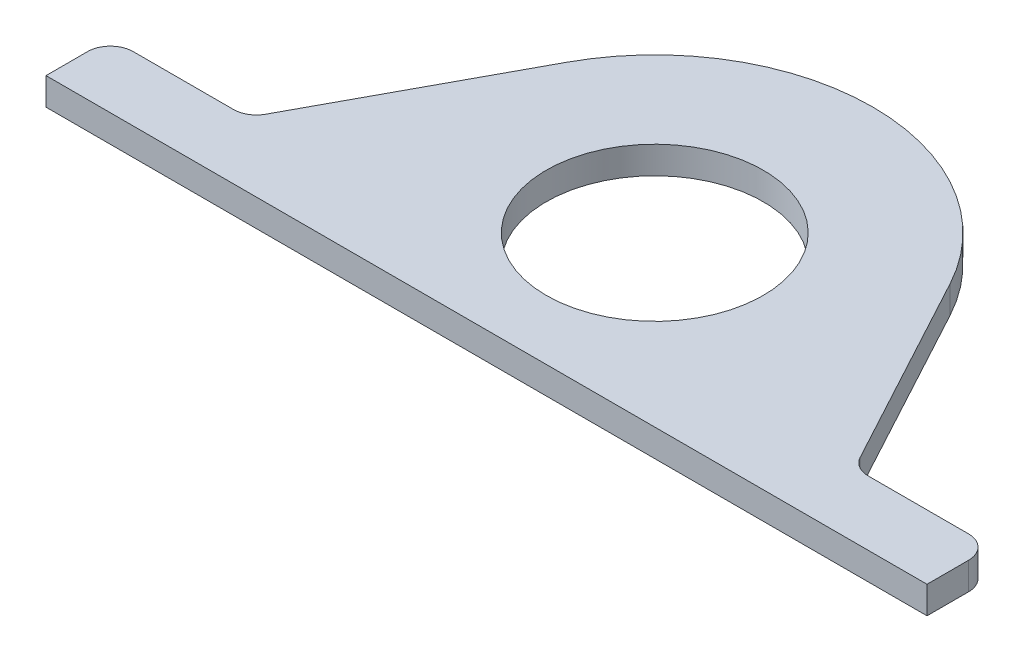
ISO-10303-21;
HEADER;
FILE_DESCRIPTION(('STEP AP214'),'2;1');
FILE_NAME('part.step','',(''),(''),'','','');
FILE_SCHEMA(('AUTOMOTIVE_DESIGN { 1 0 10303 214 1 1 1 1 }'));
ENDSEC;
DATA;
#1=APPLICATION_CONTEXT('core data for automotive mechanical design processes');
#2=APPLICATION_PROTOCOL_DEFINITION('international standard','automotive_design',2000,#1);
#3=PRODUCT_CONTEXT('',#1,'mechanical');
#4=PRODUCT('Part','Part','',(#3));
#5=PRODUCT_RELATED_PRODUCT_CATEGORY('part','',(#4));
#6=PRODUCT_DEFINITION_FORMATION('','',#4);
#7=PRODUCT_DEFINITION_CONTEXT('part definition',#1,'design');
#8=PRODUCT_DEFINITION('design','',#6,#7);
#9=PRODUCT_DEFINITION_SHAPE('','',#8);
#10=(LENGTH_UNIT() NAMED_UNIT(*) SI_UNIT(.MILLI.,.METRE.));
#11=(NAMED_UNIT(*) PLANE_ANGLE_UNIT() SI_UNIT($,.RADIAN.));
#12=(NAMED_UNIT(*) SI_UNIT($,.STERADIAN.) SOLID_ANGLE_UNIT());
#13=UNCERTAINTY_MEASURE_WITH_UNIT(LENGTH_MEASURE(1.E-05),#10,'distance_accuracy_value','');
#14=(GEOMETRIC_REPRESENTATION_CONTEXT(3) GLOBAL_UNCERTAINTY_ASSIGNED_CONTEXT((#13)) GLOBAL_UNIT_ASSIGNED_CONTEXT((#10,
#11,#12)) REPRESENTATION_CONTEXT('',''));
#15=CARTESIAN_POINT('',(0.,0.,0.));
#16=DIRECTION('',(0.,0.,1.));
#17=DIRECTION('',(1.,0.,0.));
#18=AXIS2_PLACEMENT_3D('',#15,#16,#17);
#19=CARTESIAN_POINT('',(-91.605676950577,6.,27.7755528274665));
#20=DIRECTION('',(0.,-1.,0.));
#21=DIRECTION('',(0.,0.,-1.));
#22=AXIS2_PLACEMENT_3D('',#19,#20,#21);
#23=PLANE('',#22);
#24=DIRECTION('',(0.,0.,1.));
#25=VECTOR('',#24,1.);
#26=CARTESIAN_POINT('',(-96.605676950577,6.,27.7755528274665));
#27=LINE('',#26,#25);
#28=CARTESIAN_POINT('',(-96.605676950577,6.,27.7755528274665));
#29=VERTEX_POINT('',#28);
#30=CARTESIAN_POINT('',(-96.605676950577,6.,36.9));
#31=VERTEX_POINT('',#30);
#32=EDGE_CURVE('E148',#29,#31,#27,.T.);
#33=ORIENTED_EDGE('',*,*,#32,.T.);
#34=DIRECTION('',(1.,0.,0.));
#35=VECTOR('',#34,1.);
#36=CARTESIAN_POINT('',(-91.605676950577,6.,36.9));
#37=LINE('',#36,#35);
#38=CARTESIAN_POINT('',(96.6056769505771,6.,36.9));
#39=VERTEX_POINT('',#38);
#40=EDGE_CURVE('E48',#31,#39,#37,.T.);
#41=ORIENTED_EDGE('',*,*,#40,.T.);
#42=DIRECTION('',(0.,0.,-1.));
#43=VECTOR('',#42,1.);
#44=CARTESIAN_POINT('',(96.605676950577,6.,27.7755528274665));
#45=LINE('',#44,#43);
#46=CARTESIAN_POINT('',(96.605676950577,6.,27.7755528274665));
#47=VERTEX_POINT('',#46);
#48=EDGE_CURVE('E102',#39,#47,#45,.T.);
#49=ORIENTED_EDGE('',*,*,#48,.T.);
#50=CARTESIAN_POINT('',(91.605676950577,6.,27.7755528274665));
#51=DIRECTION('',(0.,1.,0.));
#52=DIRECTION('',(0.,0.,-1.));
#53=AXIS2_PLACEMENT_3D('',#50,#51,#52);
#54=CIRCLE('',#53,5.00000000000001);
#55=CARTESIAN_POINT('',(91.605676950577,6.,22.7755528274664));
#56=VERTEX_POINT('',#55);
#57=EDGE_CURVE('E199',#47,#56,#54,.T.);
#58=ORIENTED_EDGE('',*,*,#57,.T.);
#59=DIRECTION('',(-1.,0.,0.));
#60=VECTOR('',#59,1.);
#61=CARTESIAN_POINT('',(69.5890954122525,6.,22.7755528274664));
#62=LINE('',#61,#60);
#63=CARTESIAN_POINT('',(69.5890954122525,6.,22.7755528274664));
#64=VERTEX_POINT('',#63);
#65=EDGE_CURVE('E221',#56,#64,#62,.T.);
#66=ORIENTED_EDGE('',*,*,#65,.T.);
#67=CARTESIAN_POINT('',(69.5890954122525,6.,17.7755528274664));
#68=DIRECTION('',(0.,-1.,0.));
#69=DIRECTION('',(0.,0.,1.));
#70=AXIS2_PLACEMENT_3D('',#67,#68,#69);
#71=CIRCLE('',#70,5.00000000000001);
#72=CARTESIAN_POINT('',(65.1888751835243,6.,20.1500131743014));
#73=VERTEX_POINT('',#72);
#74=EDGE_CURVE('E218',#64,#73,#71,.T.);
#75=ORIENTED_EDGE('',*,*,#74,.T.);
#76=DIRECTION('',(-0.474892069366983,0.,-0.880044045745635));
#77=VECTOR('',#76,1.);
#78=CARTESIAN_POINT('',(42.0661053866413,6.,-22.6998409157418));
#79=LINE('',#78,#77);
#80=CARTESIAN_POINT('',(42.0661053866413,6.,-22.6998409157418));
#81=VERTEX_POINT('',#80);
#82=EDGE_CURVE('E220',#73,#81,#79,.T.);
#83=ORIENTED_EDGE('',*,*,#82,.T.);
#84=CARTESIAN_POINT('',(0.,6.,0.));
#85=DIRECTION('',(0.,1.,0.));
#86=DIRECTION('',(0.,0.,1.));
#87=AXIS2_PLACEMENT_3D('',#84,#85,#86);
#88=CIRCLE('',#87,47.8);
#89=CARTESIAN_POINT('',(-42.0661053866413,6.,-22.6998409157417));
#90=VERTEX_POINT('',#89);
#91=EDGE_CURVE('E223',#81,#90,#88,.T.);
#92=ORIENTED_EDGE('',*,*,#91,.T.);
#93=DIRECTION('',(-0.474892069366983,0.,0.880044045745635));
#94=VECTOR('',#93,1.);
#95=CARTESIAN_POINT('',(-65.1888751835243,6.,20.1500131743014));
#96=LINE('',#95,#94);
#97=CARTESIAN_POINT('',(-65.1888751835243,6.,20.1500131743014));
#98=VERTEX_POINT('',#97);
#99=EDGE_CURVE('E131',#90,#98,#96,.T.);
#100=ORIENTED_EDGE('',*,*,#99,.T.);
#101=CARTESIAN_POINT('',(-69.5890954122525,6.,17.7755528274665));
#102=DIRECTION('',(0.,-1.,0.));
#103=DIRECTION('',(0.,0.,-1.));
#104=AXIS2_PLACEMENT_3D('',#101,#102,#103);
#105=CIRCLE('',#104,5.00000000000001);
#106=CARTESIAN_POINT('',(-69.5890954122525,6.,22.7755528274665));
#107=VERTEX_POINT('',#106);
#108=EDGE_CURVE('E124',#98,#107,#105,.T.);
#109=ORIENTED_EDGE('',*,*,#108,.T.);
#110=DIRECTION('',(-1.,0.,0.));
#111=VECTOR('',#110,1.);
#112=CARTESIAN_POINT('',(-69.5890954122525,6.,22.7755528274665));
#113=LINE('',#112,#111);
#114=CARTESIAN_POINT('',(-91.605676950577,6.,22.7755528274665));
#115=VERTEX_POINT('',#114);
#116=EDGE_CURVE('E128',#107,#115,#113,.T.);
#117=ORIENTED_EDGE('',*,*,#116,.T.);
#118=CARTESIAN_POINT('',(-91.605676950577,6.,27.7755528274665));
#119=DIRECTION('',(0.,1.,0.));
#120=DIRECTION('',(0.,0.,-1.));
#121=AXIS2_PLACEMENT_3D('',#118,#119,#120);
#122=CIRCLE('',#121,5.00000000000001);
#123=EDGE_CURVE('E56',#115,#29,#122,.T.);
#124=ORIENTED_EDGE('',*,*,#123,.T.);
#125=EDGE_LOOP('',(#33,#41,#49,#58,#66,#75,#83,#92,#100,#109,#117,#124));
#126=FACE_BOUND('',#125,.T.);
#127=CARTESIAN_POINT('',(0.,6.,0.));
#128=DIRECTION('',(0.,1.,0.));
#129=DIRECTION('',(0.,0.,1.));
#130=AXIS2_PLACEMENT_3D('',#127,#128,#129);
#131=CIRCLE('',#130,23.8);
#132=CARTESIAN_POINT('',(0.,6.,23.8));
#133=VERTEX_POINT('',#132);
#134=EDGE_CURVE('E157',#133,#133,#131,.T.);
#135=ORIENTED_EDGE('',*,*,#134,.F.);
#136=EDGE_LOOP('',(#135));
#137=FACE_BOUND('',#136,.T.);
#138=ADVANCED_FACE('F33',(#126,#137),#23,.F.);
#139=CARTESIAN_POINT('',(-91.605676950577,0.,27.7755528274665));
#140=DIRECTION('',(0.,-1.,0.));
#141=DIRECTION('',(0.,0.,-1.));
#142=AXIS2_PLACEMENT_3D('',#139,#140,#141);
#143=PLANE('',#142);
#144=DIRECTION('',(1.,0.,0.));
#145=VECTOR('',#144,1.);
#146=CARTESIAN_POINT('',(114.691020375286,0.,36.9));
#147=LINE('',#146,#145);
#148=CARTESIAN_POINT('',(-96.605676950577,0.,36.9));
#149=VERTEX_POINT('',#148);
#150=CARTESIAN_POINT('',(96.605676950577,0.,36.9));
#151=VERTEX_POINT('',#150);
#152=EDGE_CURVE('E243',#149,#151,#147,.T.);
#153=ORIENTED_EDGE('',*,*,#152,.F.);
#154=DIRECTION('',(0.,0.,1.));
#155=VECTOR('',#154,1.);
#156=CARTESIAN_POINT('',(-96.605676950577,0.,27.7755528274665));
#157=LINE('',#156,#155);
#158=CARTESIAN_POINT('',(-96.605676950577,0.,27.7755528274665));
#159=VERTEX_POINT('',#158);
#160=EDGE_CURVE('E173',#159,#149,#157,.T.);
#161=ORIENTED_EDGE('',*,*,#160,.F.);
#162=CARTESIAN_POINT('',(-91.605676950577,0.,27.7755528274665));
#163=DIRECTION('',(0.,1.,0.));
#164=DIRECTION('',(0.,0.,-1.));
#165=AXIS2_PLACEMENT_3D('',#162,#163,#164);
#166=CIRCLE('',#165,5.00000000000001);
#167=CARTESIAN_POINT('',(-91.605676950577,0.,22.7755528274665));
#168=VERTEX_POINT('',#167);
#169=EDGE_CURVE('E95',#168,#159,#166,.T.);
#170=ORIENTED_EDGE('',*,*,#169,.F.);
#171=DIRECTION('',(-1.,0.,0.));
#172=VECTOR('',#171,1.);
#173=CARTESIAN_POINT('',(-69.5890954122525,0.,22.7755528274665));
#174=LINE('',#173,#172);
#175=CARTESIAN_POINT('',(-69.5890954122525,0.,22.7755528274665));
#176=VERTEX_POINT('',#175);
#177=EDGE_CURVE('E170',#176,#168,#174,.T.);
#178=ORIENTED_EDGE('',*,*,#177,.F.);
#179=CARTESIAN_POINT('',(-69.5890954122525,0.,17.7755528274665));
#180=DIRECTION('',(0.,-1.,0.));
#181=DIRECTION('',(0.,0.,-1.));
#182=AXIS2_PLACEMENT_3D('',#179,#180,#181);
#183=CIRCLE('',#182,5.00000000000001);
#184=CARTESIAN_POINT('',(-65.1888751835243,0.,20.1500131743014));
#185=VERTEX_POINT('',#184);
#186=EDGE_CURVE('E140',#185,#176,#183,.T.);
#187=ORIENTED_EDGE('',*,*,#186,.F.);
#188=DIRECTION('',(-0.474892069366983,0.,0.880044045745635));
#189=VECTOR('',#188,1.);
#190=CARTESIAN_POINT('',(-65.1888751835243,0.,20.1500131743014));
#191=LINE('',#190,#189);
#192=CARTESIAN_POINT('',(-42.0661053866413,0.,-22.6998409157417));
#193=VERTEX_POINT('',#192);
#194=EDGE_CURVE('E167',#193,#185,#191,.T.);
#195=ORIENTED_EDGE('',*,*,#194,.F.);
#196=CARTESIAN_POINT('',(0.,0.,0.));
#197=DIRECTION('',(0.,1.,0.));
#198=DIRECTION('',(0.,0.,1.));
#199=AXIS2_PLACEMENT_3D('',#196,#197,#198);
#200=CIRCLE('',#199,47.8);
#201=CARTESIAN_POINT('',(42.0661053866413,0.,-22.6998409157418));
#202=VERTEX_POINT('',#201);
#203=EDGE_CURVE('E165',#202,#193,#200,.T.);
#204=ORIENTED_EDGE('',*,*,#203,.F.);
#205=DIRECTION('',(-0.474892069366983,0.,-0.880044045745635));
#206=VECTOR('',#205,1.);
#207=CARTESIAN_POINT('',(42.0661053866413,0.,-22.6998409157418));
#208=LINE('',#207,#206);
#209=CARTESIAN_POINT('',(65.1888751835243,0.,20.1500131743014));
#210=VERTEX_POINT('',#209);
#211=EDGE_CURVE('E163',#210,#202,#208,.T.);
#212=ORIENTED_EDGE('',*,*,#211,.F.);
#213=CARTESIAN_POINT('',(69.5890954122525,0.,17.7755528274664));
#214=DIRECTION('',(0.,-1.,0.));
#215=DIRECTION('',(0.,0.,1.));
#216=AXIS2_PLACEMENT_3D('',#213,#214,#215);
#217=CIRCLE('',#216,5.00000000000001);
#218=CARTESIAN_POINT('',(69.5890954122525,0.,22.7755528274664));
#219=VERTEX_POINT('',#218);
#220=EDGE_CURVE('E161',#219,#210,#217,.T.);
#221=ORIENTED_EDGE('',*,*,#220,.F.);
#222=DIRECTION('',(-1.,0.,0.));
#223=VECTOR('',#222,1.);
#224=CARTESIAN_POINT('',(69.5890954122525,0.,22.7755528274664));
#225=LINE('',#224,#223);
#226=CARTESIAN_POINT('',(91.605676950577,0.,22.7755528274664));
#227=VERTEX_POINT('',#226);
#228=EDGE_CURVE('E159',#227,#219,#225,.T.);
#229=ORIENTED_EDGE('',*,*,#228,.F.);
#230=CARTESIAN_POINT('',(91.605676950577,0.,27.7755528274665));
#231=DIRECTION('',(0.,1.,0.));
#232=DIRECTION('',(0.,0.,-1.));
#233=AXIS2_PLACEMENT_3D('',#230,#231,#232);
#234=CIRCLE('',#233,5.00000000000001);
#235=CARTESIAN_POINT('',(96.605676950577,0.,27.7755528274665));
#236=VERTEX_POINT('',#235);
#237=EDGE_CURVE('E156',#236,#227,#234,.T.);
#238=ORIENTED_EDGE('',*,*,#237,.F.);
#239=DIRECTION('',(0.,0.,-1.));
#240=VECTOR('',#239,1.);
#241=CARTESIAN_POINT('',(96.605676950577,0.,27.7755528274665));
#242=LINE('',#241,#240);
#243=EDGE_CURVE('E154',#151,#236,#242,.T.);
#244=ORIENTED_EDGE('',*,*,#243,.F.);
#245=EDGE_LOOP('',(#153,#161,#170,#178,#187,#195,#204,#212,#221,#229,#238,#244));
#246=FACE_BOUND('',#245,.T.);
#247=CARTESIAN_POINT('',(0.,0.,0.));
#248=DIRECTION('',(0.,1.,0.));
#249=DIRECTION('',(0.,0.,1.));
#250=AXIS2_PLACEMENT_3D('',#247,#248,#249);
#251=CIRCLE('',#250,23.8);
#252=CARTESIAN_POINT('',(0.,0.,23.8));
#253=VERTEX_POINT('',#252);
#254=EDGE_CURVE('E248',#253,#253,#251,.T.);
#255=ORIENTED_EDGE('',*,*,#254,.T.);
#256=EDGE_LOOP('',(#255));
#257=FACE_BOUND('',#256,.T.);
#258=ADVANCED_FACE('F205',(#246,#257),#143,.T.);
#259=CARTESIAN_POINT('',(96.605676950577,6.,27.7755528274665));
#260=DIRECTION('',(-1.,0.,0.));
#261=DIRECTION('',(0.,0.,1.));
#262=AXIS2_PLACEMENT_3D('',#259,#260,#261);
#263=PLANE('',#262);
#264=ORIENTED_EDGE('',*,*,#48,.F.);
#265=DIRECTION('',(0.,-1.,0.));
#266=VECTOR('',#265,1.);
#267=CARTESIAN_POINT('',(96.605676950577,6.,36.9));
#268=LINE('',#267,#266);
#269=EDGE_CURVE('E242',#39,#151,#268,.T.);
#270=ORIENTED_EDGE('',*,*,#269,.T.);
#271=ORIENTED_EDGE('',*,*,#243,.T.);
#272=DIRECTION('',(0.,-1.,0.));
#273=VECTOR('',#272,1.);
#274=CARTESIAN_POINT('',(96.605676950577,6.,27.7755528274665));
#275=LINE('',#274,#273);
#276=EDGE_CURVE('E41',#47,#236,#275,.T.);
#277=ORIENTED_EDGE('',*,*,#276,.F.);
#278=EDGE_LOOP('',(#264,#270,#271,#277));
#279=FACE_BOUND('',#278,.T.);
#280=ADVANCED_FACE('F35',(#279),#263,.F.);
#281=CARTESIAN_POINT('',(91.605676950577,6.,27.7755528274665));
#282=DIRECTION('',(0.,-1.,0.));
#283=DIRECTION('',(0.,0.,-1.));
#284=AXIS2_PLACEMENT_3D('',#281,#282,#283);
#285=CYLINDRICAL_SURFACE('',#284,5.00000000000001);
#286=ORIENTED_EDGE('',*,*,#237,.T.);
#287=DIRECTION('',(0.,-1.,0.));
#288=VECTOR('',#287,1.);
#289=CARTESIAN_POINT('',(91.605676950577,6.,22.7755528274664));
#290=LINE('',#289,#288);
#291=EDGE_CURVE('E191',#56,#227,#290,.T.);
#292=ORIENTED_EDGE('',*,*,#291,.F.);
#293=ORIENTED_EDGE('',*,*,#57,.F.);
#294=ORIENTED_EDGE('',*,*,#276,.T.);
#295=EDGE_LOOP('',(#286,#292,#293,#294));
#296=FACE_BOUND('',#295,.T.);
#297=ADVANCED_FACE('F197',(#296),#285,.T.);
#298=CARTESIAN_POINT('',(69.5890954122525,6.,22.7755528274664));
#299=DIRECTION('',(0.,0.,1.));
#300=DIRECTION('',(1.,0.,0.));
#301=AXIS2_PLACEMENT_3D('',#298,#299,#300);
#302=PLANE('',#301);
#303=ORIENTED_EDGE('',*,*,#228,.T.);
#304=DIRECTION('',(0.,-1.,0.));
#305=VECTOR('',#304,1.);
#306=CARTESIAN_POINT('',(69.5890954122525,6.,22.7755528274664));
#307=LINE('',#306,#305);
#308=EDGE_CURVE('E188',#64,#219,#307,.T.);
#309=ORIENTED_EDGE('',*,*,#308,.F.);
#310=ORIENTED_EDGE('',*,*,#65,.F.);
#311=ORIENTED_EDGE('',*,*,#291,.T.);
#312=EDGE_LOOP('',(#303,#309,#310,#311));
#313=FACE_BOUND('',#312,.T.);
#314=ADVANCED_FACE('F212',(#313),#302,.F.);
#315=CARTESIAN_POINT('',(69.5890954122525,6.,17.7755528274664));
#316=DIRECTION('',(0.,-1.,0.));
#317=DIRECTION('',(0.,0.,-1.));
#318=AXIS2_PLACEMENT_3D('',#315,#316,#317);
#319=CYLINDRICAL_SURFACE('',#318,5.00000000000001);
#320=ORIENTED_EDGE('',*,*,#220,.T.);
#321=DIRECTION('',(0.,-1.,0.));
#322=VECTOR('',#321,1.);
#323=CARTESIAN_POINT('',(65.1888751835243,6.,20.1500131743014));
#324=LINE('',#323,#322);
#325=EDGE_CURVE('E185',#73,#210,#324,.T.);
#326=ORIENTED_EDGE('',*,*,#325,.F.);
#327=ORIENTED_EDGE('',*,*,#74,.F.);
#328=ORIENTED_EDGE('',*,*,#308,.T.);
#329=EDGE_LOOP('',(#320,#326,#327,#328));
#330=FACE_BOUND('',#329,.T.);
#331=ADVANCED_FACE('F216',(#330),#319,.F.);
#332=CARTESIAN_POINT('',(42.0661053866413,6.,-22.6998409157418));
#333=DIRECTION('',(-0.880044045745635,0.,0.474892069366983));
#334=DIRECTION('',(0.474892069366983,0.,0.880044045745635));
#335=AXIS2_PLACEMENT_3D('',#332,#333,#334);
#336=PLANE('',#335);
#337=ORIENTED_EDGE('',*,*,#211,.T.);
#338=DIRECTION('',(0.,-1.,0.));
#339=VECTOR('',#338,1.);
#340=CARTESIAN_POINT('',(42.0661053866413,6.,-22.6998409157418));
#341=LINE('',#340,#339);
#342=EDGE_CURVE('E182',#81,#202,#341,.T.);
#343=ORIENTED_EDGE('',*,*,#342,.F.);
#344=ORIENTED_EDGE('',*,*,#82,.F.);
#345=ORIENTED_EDGE('',*,*,#325,.T.);
#346=EDGE_LOOP('',(#337,#343,#344,#345));
#347=FACE_BOUND('',#346,.T.);
#348=ADVANCED_FACE('F285',(#347),#336,.F.);
#349=CARTESIAN_POINT('',(0.,6.,0.));
#350=DIRECTION('',(0.,-1.,0.));
#351=DIRECTION('',(0.,0.,-1.));
#352=AXIS2_PLACEMENT_3D('',#349,#350,#351);
#353=CYLINDRICAL_SURFACE('',#352,47.8);
#354=ORIENTED_EDGE('',*,*,#203,.T.);
#355=DIRECTION('',(0.,-1.,0.));
#356=VECTOR('',#355,1.);
#357=CARTESIAN_POINT('',(-42.0661053866413,6.,-22.6998409157417));
#358=LINE('',#357,#356);
#359=EDGE_CURVE('E179',#90,#193,#358,.T.);
#360=ORIENTED_EDGE('',*,*,#359,.F.);
#361=ORIENTED_EDGE('',*,*,#91,.F.);
#362=ORIENTED_EDGE('',*,*,#342,.T.);
#363=EDGE_LOOP('',(#354,#360,#361,#362));
#364=FACE_BOUND('',#363,.T.);
#365=ADVANCED_FACE('F232',(#364),#353,.T.);
#366=CARTESIAN_POINT('',(-65.1888751835243,6.,20.1500131743014));
#367=DIRECTION('',(0.880044045745635,0.,0.474892069366983));
#368=DIRECTION('',(0.474892069366983,0.,-0.880044045745635));
#369=AXIS2_PLACEMENT_3D('',#366,#367,#368);
#370=PLANE('',#369);
#371=ORIENTED_EDGE('',*,*,#194,.T.);
#372=DIRECTION('',(0.,-1.,0.));
#373=VECTOR('',#372,1.);
#374=CARTESIAN_POINT('',(-65.1888751835243,6.,20.1500131743014));
#375=LINE('',#374,#373);
#376=EDGE_CURVE('E143',#98,#185,#375,.T.);
#377=ORIENTED_EDGE('',*,*,#376,.F.);
#378=ORIENTED_EDGE('',*,*,#99,.F.);
#379=ORIENTED_EDGE('',*,*,#359,.T.);
#380=EDGE_LOOP('',(#371,#377,#378,#379));
#381=FACE_BOUND('',#380,.T.);
#382=ADVANCED_FACE('F236',(#381),#370,.F.);
#383=CARTESIAN_POINT('',(-69.5890954122525,6.,17.7755528274665));
#384=DIRECTION('',(0.,-1.,0.));
#385=DIRECTION('',(0.,0.,-1.));
#386=AXIS2_PLACEMENT_3D('',#383,#384,#385);
#387=CYLINDRICAL_SURFACE('',#386,5.00000000000001);
#388=ORIENTED_EDGE('',*,*,#186,.T.);
#389=DIRECTION('',(0.,-1.,0.));
#390=VECTOR('',#389,1.);
#391=CARTESIAN_POINT('',(-69.5890954122525,6.,22.7755528274665));
#392=LINE('',#391,#390);
#393=EDGE_CURVE('E137',#107,#176,#392,.T.);
#394=ORIENTED_EDGE('',*,*,#393,.F.);
#395=ORIENTED_EDGE('',*,*,#108,.F.);
#396=ORIENTED_EDGE('',*,*,#376,.T.);
#397=EDGE_LOOP('',(#388,#394,#395,#396));
#398=FACE_BOUND('',#397,.T.);
#399=ADVANCED_FACE('F138',(#398),#387,.F.);
#400=CARTESIAN_POINT('',(-69.5890954122525,6.,22.7755528274665));
#401=DIRECTION('',(0.,0.,1.));
#402=DIRECTION('',(1.,0.,0.));
#403=AXIS2_PLACEMENT_3D('',#400,#401,#402);
#404=PLANE('',#403);
#405=ORIENTED_EDGE('',*,*,#177,.T.);
#406=DIRECTION('',(0.,-1.,0.));
#407=VECTOR('',#406,1.);
#408=CARTESIAN_POINT('',(-91.605676950577,6.,22.7755528274665));
#409=LINE('',#408,#407);
#410=EDGE_CURVE('E144',#115,#168,#409,.T.);
#411=ORIENTED_EDGE('',*,*,#410,.F.);
#412=ORIENTED_EDGE('',*,*,#116,.F.);
#413=ORIENTED_EDGE('',*,*,#393,.T.);
#414=EDGE_LOOP('',(#405,#411,#412,#413));
#415=FACE_BOUND('',#414,.T.);
#416=ADVANCED_FACE('F146',(#415),#404,.F.);
#417=CARTESIAN_POINT('',(-91.605676950577,6.,27.7755528274665));
#418=DIRECTION('',(0.,-1.,0.));
#419=DIRECTION('',(0.,0.,-1.));
#420=AXIS2_PLACEMENT_3D('',#417,#418,#419);
#421=CYLINDRICAL_SURFACE('',#420,5.00000000000001);
#422=ORIENTED_EDGE('',*,*,#169,.T.);
#423=DIRECTION('',(0.,-1.,0.));
#424=VECTOR('',#423,1.);
#425=CARTESIAN_POINT('',(-96.605676950577,6.,27.7755528274665));
#426=LINE('',#425,#424);
#427=EDGE_CURVE('E153',#29,#159,#426,.T.);
#428=ORIENTED_EDGE('',*,*,#427,.F.);
#429=ORIENTED_EDGE('',*,*,#123,.F.);
#430=ORIENTED_EDGE('',*,*,#410,.T.);
#431=EDGE_LOOP('',(#422,#428,#429,#430));
#432=FACE_BOUND('',#431,.T.);
#433=ADVANCED_FACE('F238',(#432),#421,.T.);
#434=CARTESIAN_POINT('',(-96.605676950577,6.,27.7755528274665));
#435=DIRECTION('',(1.,0.,0.));
#436=DIRECTION('',(0.,0.,-1.));
#437=AXIS2_PLACEMENT_3D('',#434,#435,#436);
#438=PLANE('',#437);
#439=ORIENTED_EDGE('',*,*,#160,.T.);
#440=DIRECTION('',(0.,1.,0.));
#441=VECTOR('',#440,1.);
#442=CARTESIAN_POINT('',(-96.605676950577,6.,36.9));
#443=LINE('',#442,#441);
#444=EDGE_CURVE('E11',#149,#31,#443,.T.);
#445=ORIENTED_EDGE('',*,*,#444,.T.);
#446=ORIENTED_EDGE('',*,*,#32,.F.);
#447=ORIENTED_EDGE('',*,*,#427,.T.);
#448=EDGE_LOOP('',(#439,#445,#446,#447));
#449=FACE_BOUND('',#448,.T.);
#450=ADVANCED_FACE('F241',(#449),#438,.F.);
#451=CARTESIAN_POINT('',(0.,6.,0.));
#452=DIRECTION('',(0.,-1.,0.));
#453=DIRECTION('',(0.,0.,-1.));
#454=AXIS2_PLACEMENT_3D('',#451,#452,#453);
#455=CYLINDRICAL_SURFACE('',#454,23.8);
#456=ORIENTED_EDGE('',*,*,#134,.T.);
#457=EDGE_LOOP('',(#456));
#458=FACE_BOUND('',#457,.T.);
#459=ORIENTED_EDGE('',*,*,#254,.F.);
#460=EDGE_LOOP('',(#459));
#461=FACE_BOUND('',#460,.T.);
#462=ADVANCED_FACE('F259',(#458,#461),#455,.F.);
#463=CARTESIAN_POINT('',(114.691020375286,10.,36.9));
#464=DIRECTION('',(0.,0.,-1.));
#465=DIRECTION('',(-1.,0.,0.));
#466=AXIS2_PLACEMENT_3D('',#463,#464,#465);
#467=PLANE('',#466);
#468=ORIENTED_EDGE('',*,*,#40,.F.);
#469=ORIENTED_EDGE('',*,*,#444,.F.);
#470=ORIENTED_EDGE('',*,*,#152,.T.);
#471=ORIENTED_EDGE('',*,*,#269,.F.);
#472=EDGE_LOOP('',(#468,#469,#470,#471));
#473=FACE_BOUND('',#472,.T.);
#474=ADVANCED_FACE('F255',(#473),#467,.F.);
#475=CLOSED_SHELL('',(#138,#258,#280,#297,#314,#331,#348,#365,#382,#399,#416,#433,#450,#462,#474));
#476=MANIFOLD_SOLID_BREP('B2',#475);
#477=ADVANCED_BREP_SHAPE_REPRESENTATION('',(#18,#476),#14);
#478=SHAPE_DEFINITION_REPRESENTATION(#9,#477);
ENDSEC;
END-ISO-10303-21;
